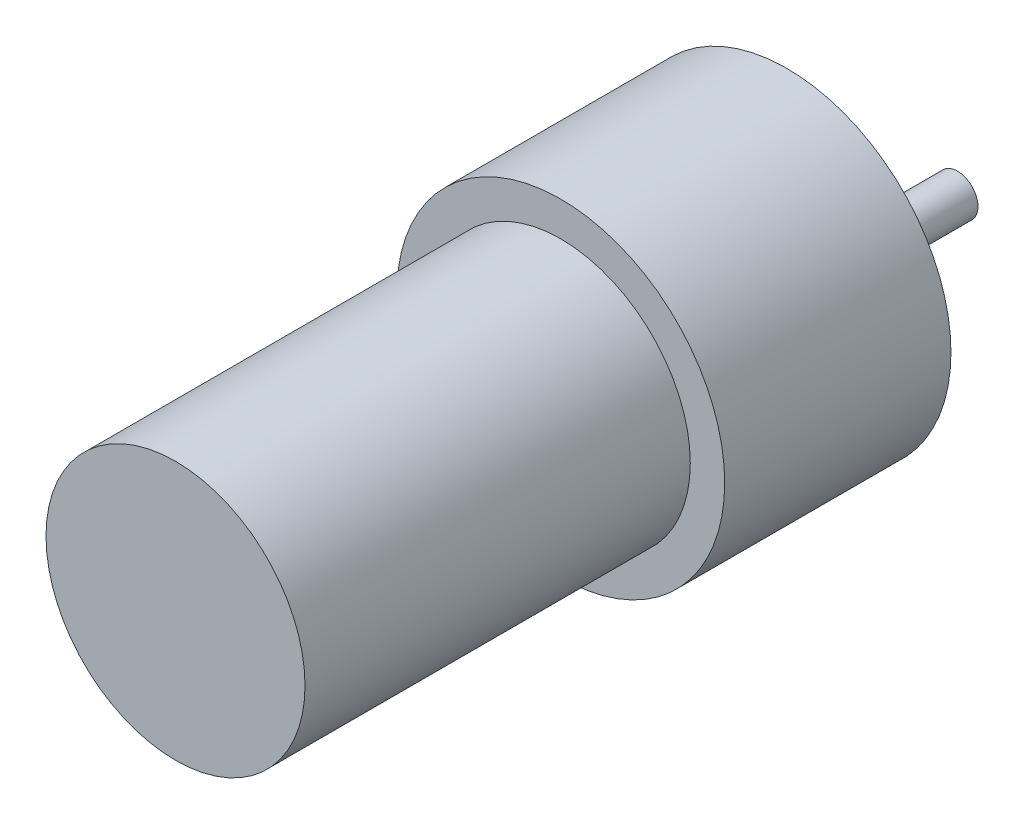
ISO-10303-21;
HEADER;
FILE_DESCRIPTION(('STEP AP214'),'2;1');
FILE_NAME('part.step','',(''),(''),'','','');
FILE_SCHEMA(('AUTOMOTIVE_DESIGN { 1 0 10303 214 1 1 1 1 }'));
ENDSEC;
DATA;
#1=APPLICATION_CONTEXT('core data for automotive mechanical design processes');
#2=APPLICATION_PROTOCOL_DEFINITION('international standard','automotive_design',2000,#1);
#3=PRODUCT_CONTEXT('',#1,'mechanical');
#4=PRODUCT('Part','Part','',(#3));
#5=PRODUCT_RELATED_PRODUCT_CATEGORY('part','',(#4));
#6=PRODUCT_DEFINITION_FORMATION('','',#4);
#7=PRODUCT_DEFINITION_CONTEXT('part definition',#1,'design');
#8=PRODUCT_DEFINITION('design','',#6,#7);
#9=PRODUCT_DEFINITION_SHAPE('','',#8);
#10=(LENGTH_UNIT() NAMED_UNIT(*) SI_UNIT(.MILLI.,.METRE.));
#11=(NAMED_UNIT(*) PLANE_ANGLE_UNIT() SI_UNIT($,.RADIAN.));
#12=(NAMED_UNIT(*) SI_UNIT($,.STERADIAN.) SOLID_ANGLE_UNIT());
#13=UNCERTAINTY_MEASURE_WITH_UNIT(LENGTH_MEASURE(1.E-05),#10,'distance_accuracy_value','');
#14=(GEOMETRIC_REPRESENTATION_CONTEXT(3) GLOBAL_UNCERTAINTY_ASSIGNED_CONTEXT((#13)) GLOBAL_UNIT_ASSIGNED_CONTEXT((#10,
#11,#12)) REPRESENTATION_CONTEXT('',''));
#15=CARTESIAN_POINT('',(0.,0.,0.));
#16=DIRECTION('',(0.,0.,1.));
#17=DIRECTION('',(1.,0.,0.));
#18=AXIS2_PLACEMENT_3D('',#15,#16,#17);
#19=CARTESIAN_POINT('',(0.,0.,35.052));
#20=DIRECTION('',(0.,0.,-1.));
#21=DIRECTION('',(-1.,0.,0.));
#22=AXIS2_PLACEMENT_3D('',#19,#20,#21);
#23=CYLINDRICAL_SURFACE('',#22,25.4);
#24=CARTESIAN_POINT('',(0.,0.,35.052));
#25=DIRECTION('',(0.,0.,1.));
#26=DIRECTION('',(1.,0.,0.));
#27=AXIS2_PLACEMENT_3D('',#24,#25,#26);
#28=CIRCLE('',#27,25.4);
#29=CARTESIAN_POINT('',(25.4,0.,35.052));
#30=VERTEX_POINT('',#29);
#31=EDGE_CURVE('E39',#30,#30,#28,.T.);
#32=ORIENTED_EDGE('',*,*,#31,.F.);
#33=EDGE_LOOP('',(#32));
#34=FACE_BOUND('',#33,.T.);
#35=CARTESIAN_POINT('',(0.,0.,0.));
#36=DIRECTION('',(0.,0.,1.));
#37=DIRECTION('',(1.,0.,0.));
#38=AXIS2_PLACEMENT_3D('',#35,#36,#37);
#39=CIRCLE('',#38,25.4);
#40=CARTESIAN_POINT('',(25.4,0.,0.));
#41=VERTEX_POINT('',#40);
#42=EDGE_CURVE('E43',#41,#41,#39,.T.);
#43=ORIENTED_EDGE('',*,*,#42,.T.);
#44=EDGE_LOOP('',(#43));
#45=FACE_BOUND('',#44,.T.);
#46=ADVANCED_FACE('F33',(#34,#45),#23,.T.);
#47=CARTESIAN_POINT('',(0.,0.,35.052));
#48=DIRECTION('',(0.,0.,1.));
#49=DIRECTION('',(1.,0.,0.));
#50=AXIS2_PLACEMENT_3D('',#47,#48,#49);
#51=PLANE('',#50);
#52=CARTESIAN_POINT('',(0.,0.,35.052));
#53=DIRECTION('',(0.,0.,1.));
#54=DIRECTION('',(1.,0.,0.));
#55=AXIS2_PLACEMENT_3D('',#52,#53,#54);
#56=CIRCLE('',#55,20.066);
#57=CARTESIAN_POINT('',(-20.066,0.,35.052));
#58=VERTEX_POINT('',#57);
#59=EDGE_CURVE('E50',#58,#58,#56,.T.);
#60=ORIENTED_EDGE('',*,*,#59,.F.);
#61=EDGE_LOOP('',(#60));
#62=FACE_BOUND('',#61,.T.);
#63=ORIENTED_EDGE('',*,*,#31,.T.);
#64=EDGE_LOOP('',(#63));
#65=FACE_BOUND('',#64,.T.);
#66=ADVANCED_FACE('F74',(#62,#65),#51,.T.);
#67=CARTESIAN_POINT('',(0.,0.,0.));
#68=DIRECTION('',(0.,0.,1.));
#69=DIRECTION('',(1.,0.,0.));
#70=AXIS2_PLACEMENT_3D('',#67,#68,#69);
#71=PLANE('',#70);
#72=CARTESIAN_POINT('',(0.,-4.7625,0.));
#73=DIRECTION('',(0.,0.,1.));
#74=DIRECTION('',(1.,0.,0.));
#75=AXIS2_PLACEMENT_3D('',#72,#73,#74);
#76=CIRCLE('',#75,3.175);
#77=CARTESIAN_POINT('',(3.175,-4.7625,0.));
#78=VERTEX_POINT('',#77);
#79=EDGE_CURVE('E10',#78,#78,#76,.F.);
#80=ORIENTED_EDGE('',*,*,#79,.F.);
#81=EDGE_LOOP('',(#80));
#82=FACE_BOUND('',#81,.T.);
#83=ORIENTED_EDGE('',*,*,#42,.F.);
#84=EDGE_LOOP('',(#83));
#85=FACE_BOUND('',#84,.T.);
#86=ADVANCED_FACE('F79',(#82,#85),#71,.F.);
#87=CARTESIAN_POINT('',(0.,0.,94.742));
#88=DIRECTION('',(0.,0.,-1.));
#89=DIRECTION('',(-1.,0.,0.));
#90=AXIS2_PLACEMENT_3D('',#87,#88,#89);
#91=CYLINDRICAL_SURFACE('',#90,20.066);
#92=CARTESIAN_POINT('',(0.,0.,94.742));
#93=DIRECTION('',(0.,0.,1.));
#94=DIRECTION('',(1.,0.,0.));
#95=AXIS2_PLACEMENT_3D('',#92,#93,#94);
#96=CIRCLE('',#95,20.066);
#97=CARTESIAN_POINT('',(-20.066,0.,94.742));
#98=VERTEX_POINT('',#97);
#99=EDGE_CURVE('E48',#98,#98,#96,.T.);
#100=CARTESIAN_POINT('',(-20.066,0.,94.742));
#101=CARTESIAN_POINT('',(-20.066,0.,94.1202291666666));
#102=CARTESIAN_POINT('',(-20.066,0.,93.4984583333333));
#103=CARTESIAN_POINT('',(-20.066,0.,92.2549166666667));
#104=CARTESIAN_POINT('',(-20.066,0.,91.6331458333333));
#105=CARTESIAN_POINT('',(-20.066,0.,90.3896041666667));
#106=CARTESIAN_POINT('',(-20.066,0.,89.7678333333333));
#107=CARTESIAN_POINT('',(-20.066,0.,88.5242916666667));
#108=CARTESIAN_POINT('',(-20.066,0.,87.9025208333333));
#109=CARTESIAN_POINT('',(-20.066,0.,86.6589791666667));
#110=CARTESIAN_POINT('',(-20.066,0.,86.0372083333333));
#111=CARTESIAN_POINT('',(-20.066,0.,84.7936666666667));
#112=CARTESIAN_POINT('',(-20.066,0.,84.1718958333333));
#113=CARTESIAN_POINT('',(-20.066,0.,82.9283541666667));
#114=CARTESIAN_POINT('',(-20.066,0.,82.3065833333333));
#115=CARTESIAN_POINT('',(-20.066,0.,81.0630416666666));
#116=CARTESIAN_POINT('',(-20.066,0.,80.4412708333333));
#117=CARTESIAN_POINT('',(-20.066,0.,79.1977291666667));
#118=CARTESIAN_POINT('',(-20.066,0.,78.5759583333333));
#119=CARTESIAN_POINT('',(-20.066,0.,77.3324166666667));
#120=CARTESIAN_POINT('',(-20.066,0.,76.7106458333333));
#121=CARTESIAN_POINT('',(-20.066,0.,75.4671041666667));
#122=CARTESIAN_POINT('',(-20.066,0.,74.8453333333333));
#123=CARTESIAN_POINT('',(-20.066,0.,73.6017916666667));
#124=CARTESIAN_POINT('',(-20.066,0.,72.9800208333333));
#125=CARTESIAN_POINT('',(-20.066,0.,71.7364791666667));
#126=CARTESIAN_POINT('',(-20.066,0.,71.1147083333333));
#127=CARTESIAN_POINT('',(-20.066,0.,69.8711666666667));
#128=CARTESIAN_POINT('',(-20.066,0.,69.2493958333333));
#129=CARTESIAN_POINT('',(-20.066,0.,68.0058541666667));
#130=CARTESIAN_POINT('',(-20.066,0.,67.3840833333333));
#131=CARTESIAN_POINT('',(-20.066,0.,66.1405416666666));
#132=CARTESIAN_POINT('',(-20.066,0.,65.5187708333333));
#133=CARTESIAN_POINT('',(-20.066,0.,64.2752291666667));
#134=CARTESIAN_POINT('',(-20.066,0.,63.6534583333333));
#135=CARTESIAN_POINT('',(-20.066,0.,62.4099166666667));
#136=CARTESIAN_POINT('',(-20.066,0.,61.7881458333333));
#137=CARTESIAN_POINT('',(-20.066,0.,60.5446041666667));
#138=CARTESIAN_POINT('',(-20.066,0.,59.9228333333333));
#139=CARTESIAN_POINT('',(-20.066,0.,58.6792916666667));
#140=CARTESIAN_POINT('',(-20.066,0.,58.0575208333333));
#141=CARTESIAN_POINT('',(-20.066,0.,56.8139791666667));
#142=CARTESIAN_POINT('',(-20.066,0.,56.1922083333333));
#143=CARTESIAN_POINT('',(-20.066,0.,54.9486666666667));
#144=CARTESIAN_POINT('',(-20.066,0.,54.3268958333333));
#145=CARTESIAN_POINT('',(-20.066,0.,53.0833541666667));
#146=CARTESIAN_POINT('',(-20.066,0.,52.4615833333333));
#147=CARTESIAN_POINT('',(-20.066,0.,51.2180416666667));
#148=CARTESIAN_POINT('',(-20.066,0.,50.5962708333333));
#149=CARTESIAN_POINT('',(-20.066,0.,49.3527291666667));
#150=CARTESIAN_POINT('',(-20.066,0.,48.7309583333333));
#151=CARTESIAN_POINT('',(-20.066,0.,47.4874166666667));
#152=CARTESIAN_POINT('',(-20.066,0.,46.8656458333333));
#153=CARTESIAN_POINT('',(-20.066,0.,45.6221041666667));
#154=CARTESIAN_POINT('',(-20.066,0.,45.0003333333333));
#155=CARTESIAN_POINT('',(-20.066,0.,43.7567916666667));
#156=CARTESIAN_POINT('',(-20.066,0.,43.1350208333333));
#157=CARTESIAN_POINT('',(-20.066,0.,41.8914791666667));
#158=CARTESIAN_POINT('',(-20.066,0.,41.2697083333333));
#159=CARTESIAN_POINT('',(-20.066,0.,40.0261666666667));
#160=CARTESIAN_POINT('',(-20.066,0.,39.4043958333333));
#161=CARTESIAN_POINT('',(-20.066,0.,38.1608541666667));
#162=CARTESIAN_POINT('',(-20.066,0.,37.5390833333333));
#163=CARTESIAN_POINT('',(-20.066,0.,36.2955416666667));
#164=CARTESIAN_POINT('',(-20.066,0.,35.6737708333333));
#165=CARTESIAN_POINT('',(-20.066,0.,35.052));
#166=B_SPLINE_CURVE_WITH_KNOTS('',3,(#100,#101,#102,#103,#104,#105,#106,#107,#108,#109,#110,
#111,#112,#113,#114,#115,#116,#117,#118,#119,#120,#121,#122,#123,#124,#125,#126,#127,#128,#129,
#130,#131,#132,#133,#134,#135,#136,#137,#138,#139,#140,#141,#142,#143,#144,#145,#146,#147,#148,
#149,#150,#151,#152,#153,#154,#155,#156,#157,#158,#159,#160,#161,#162,#163,#164,#165),
.UNSPECIFIED.,.F.,.F.,(4,2,2,2,2,2,2,2,2,2,2,2,2,2,2,2,2,2,2,2,2,2,2,2,2,2,2,2,2,2,2,2,4),(0.,
1.86531250000001,3.730625,5.59593750000001,7.46125,9.32656250000001,11.191875,13.0571875,
14.9225,16.7878125,18.653125,20.5184375,22.38375,24.2490625,26.114375,27.9796875,29.845,
31.7103125,33.575625,35.4409375,37.30625,39.1715625,41.036875,42.9021875,44.7675,46.6328125,
48.498125,50.3634375,52.22875,54.0940625,55.959375,57.8246875,59.69),.UNSPECIFIED.);
#167=EDGE_CURVE('BSEAM70',#98,#58,#166,.T.);
#168=ORIENTED_EDGE('',*,*,#99,.F.);
#169=ORIENTED_EDGE('',*,*,#59,.T.);
#170=ORIENTED_EDGE('',*,*,#167,.T.);
#171=ORIENTED_EDGE('',*,*,#167,.F.);
#172=EDGE_LOOP('',(#168,#170,#169,#171));
#173=FACE_BOUND('',#172,.T.);
#174=ADVANCED_FACE('F70',(#173),#91,.T.);
#175=CARTESIAN_POINT('',(0.,0.,94.742));
#176=DIRECTION('',(0.,0.,1.));
#177=DIRECTION('',(1.,0.,0.));
#178=AXIS2_PLACEMENT_3D('',#175,#176,#177);
#179=PLANE('',#178);
#180=ORIENTED_EDGE('',*,*,#99,.T.);
#181=EDGE_LOOP('',(#180));
#182=FACE_BOUND('',#181,.T.);
#183=ADVANCED_FACE('F63',(#182),#179,.T.);
#184=CARTESIAN_POINT('',(0.,-4.7625,-26.416));
#185=DIRECTION('',(0.,0.,1.));
#186=DIRECTION('',(1.,0.,0.));
#187=AXIS2_PLACEMENT_3D('',#184,#185,#186);
#188=CYLINDRICAL_SURFACE('',#187,3.175);
#189=CARTESIAN_POINT('',(0.,-4.7625,-26.416));
#190=DIRECTION('',(0.,0.,-1.));
#191=DIRECTION('',(-1.,0.,0.));
#192=AXIS2_PLACEMENT_3D('',#189,#190,#191);
#193=CIRCLE('',#192,3.175);
#194=CARTESIAN_POINT('',(-3.175,-4.7625,-26.416));
#195=VERTEX_POINT('',#194);
#196=EDGE_CURVE('E53',#195,#195,#193,.T.);
#197=ORIENTED_EDGE('',*,*,#196,.F.);
#198=EDGE_LOOP('',(#197));
#199=FACE_BOUND('',#198,.T.);
#200=ORIENTED_EDGE('',*,*,#79,.T.);
#201=EDGE_LOOP('',(#200));
#202=FACE_BOUND('',#201,.T.);
#203=ADVANCED_FACE('F61',(#199,#202),#188,.T.);
#204=CARTESIAN_POINT('',(0.,-4.7625,-26.416));
#205=DIRECTION('',(0.,0.,-1.));
#206=DIRECTION('',(-1.,0.,0.));
#207=AXIS2_PLACEMENT_3D('',#204,#205,#206);
#208=PLANE('',#207);
#209=ORIENTED_EDGE('',*,*,#196,.T.);
#210=EDGE_LOOP('',(#209));
#211=FACE_BOUND('',#210,.T.);
#212=ADVANCED_FACE('F59',(#211),#208,.T.);
#213=CLOSED_SHELL('',(#46,#66,#86,#174,#183,#203,#212));
#214=MANIFOLD_SOLID_BREP('B2',#213);
#215=ADVANCED_BREP_SHAPE_REPRESENTATION('',(#18,#214),#14);
#216=SHAPE_DEFINITION_REPRESENTATION(#9,#215);
ENDSEC;
END-ISO-10303-21;
